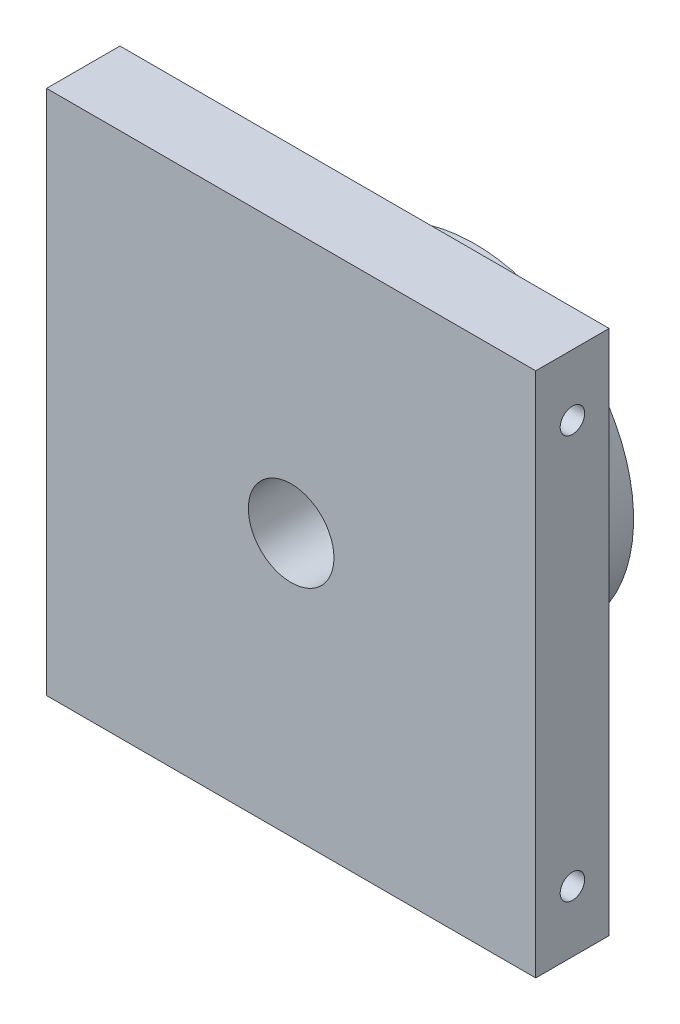
ISO-10303-21;
HEADER;
FILE_DESCRIPTION(('STEP AP214'),'2;1');
FILE_NAME('part.step','',(''),(''),'','','');
FILE_SCHEMA(('AUTOMOTIVE_DESIGN { 1 0 10303 214 1 1 1 1 }'));
ENDSEC;
DATA;
#1=APPLICATION_CONTEXT('core data for automotive mechanical design processes');
#2=APPLICATION_PROTOCOL_DEFINITION('international standard','automotive_design',2000,#1);
#3=PRODUCT_CONTEXT('',#1,'mechanical');
#4=PRODUCT('Part','Part','',(#3));
#5=PRODUCT_RELATED_PRODUCT_CATEGORY('part','',(#4));
#6=PRODUCT_DEFINITION_FORMATION('','',#4);
#7=PRODUCT_DEFINITION_CONTEXT('part definition',#1,'design');
#8=PRODUCT_DEFINITION('design','',#6,#7);
#9=PRODUCT_DEFINITION_SHAPE('','',#8);
#10=(LENGTH_UNIT() NAMED_UNIT(*) SI_UNIT(.MILLI.,.METRE.));
#11=(NAMED_UNIT(*) PLANE_ANGLE_UNIT() SI_UNIT($,.RADIAN.));
#12=(NAMED_UNIT(*) SI_UNIT($,.STERADIAN.) SOLID_ANGLE_UNIT());
#13=UNCERTAINTY_MEASURE_WITH_UNIT(LENGTH_MEASURE(1.E-05),#10,'distance_accuracy_value','');
#14=(GEOMETRIC_REPRESENTATION_CONTEXT(3) GLOBAL_UNCERTAINTY_ASSIGNED_CONTEXT((#13)) GLOBAL_UNIT_ASSIGNED_CONTEXT((#10,
#11,#12)) REPRESENTATION_CONTEXT('',''));
#15=CARTESIAN_POINT('',(0.,0.,0.));
#16=DIRECTION('',(0.,0.,1.));
#17=DIRECTION('',(1.,0.,0.));
#18=AXIS2_PLACEMENT_3D('',#15,#16,#17);
#19=CARTESIAN_POINT('',(0.,0.,6.));
#20=DIRECTION('',(0.,0.,-1.));
#21=DIRECTION('',(-1.,0.,0.));
#22=AXIS2_PLACEMENT_3D('',#19,#20,#21);
#23=PLANE('',#22);
#24=CARTESIAN_POINT('',(0.,0.,6.));
#25=DIRECTION('',(0.,0.,1.));
#26=DIRECTION('',(1.,0.,0.));
#27=AXIS2_PLACEMENT_3D('',#24,#25,#26);
#28=CIRCLE('',#27,3.5);
#29=CARTESIAN_POINT('',(3.5,0.,6.));
#30=VERTEX_POINT('',#29);
#31=EDGE_CURVE('E149',#30,#30,#28,.T.);
#32=ORIENTED_EDGE('',*,*,#31,.F.);
#33=EDGE_LOOP('',(#32));
#34=FACE_BOUND('',#33,.T.);
#35=DIRECTION('',(0.,1.,0.));
#36=VECTOR('',#35,1.);
#37=CARTESIAN_POINT('',(20.,-21.5,6.));
#38=LINE('',#37,#36);
#39=CARTESIAN_POINT('',(20.,-21.5,6.));
#40=VERTEX_POINT('',#39);
#41=CARTESIAN_POINT('',(20.,21.5,6.));
#42=VERTEX_POINT('',#41);
#43=EDGE_CURVE('E97',#40,#42,#38,.T.);
#44=ORIENTED_EDGE('',*,*,#43,.T.);
#45=DIRECTION('',(-1.,0.,0.));
#46=VECTOR('',#45,1.);
#47=CARTESIAN_POINT('',(-20.,21.5,6.));
#48=LINE('',#47,#46);
#49=CARTESIAN_POINT('',(-20.,21.5,6.));
#50=VERTEX_POINT('',#49);
#51=EDGE_CURVE('E93',#42,#50,#48,.T.);
#52=ORIENTED_EDGE('',*,*,#51,.T.);
#53=DIRECTION('',(0.,-1.,0.));
#54=VECTOR('',#53,1.);
#55=CARTESIAN_POINT('',(-20.,-21.5,6.));
#56=LINE('',#55,#54);
#57=CARTESIAN_POINT('',(-20.,-21.5,6.));
#58=VERTEX_POINT('',#57);
#59=EDGE_CURVE('E95',#50,#58,#56,.T.);
#60=ORIENTED_EDGE('',*,*,#59,.T.);
#61=DIRECTION('',(1.,0.,0.));
#62=VECTOR('',#61,1.);
#63=CARTESIAN_POINT('',(-20.,-21.5,6.));
#64=LINE('',#63,#62);
#65=EDGE_CURVE('E62',#58,#40,#64,.T.);
#66=ORIENTED_EDGE('',*,*,#65,.T.);
#67=EDGE_LOOP('',(#44,#52,#60,#66));
#68=FACE_BOUND('',#67,.T.);
#69=ADVANCED_FACE('F44',(#34,#68),#23,.F.);
#70=CARTESIAN_POINT('',(0.,0.,0.));
#71=DIRECTION('',(0.,0.,-1.));
#72=DIRECTION('',(-1.,0.,0.));
#73=AXIS2_PLACEMENT_3D('',#70,#71,#72);
#74=PLANE('',#73);
#75=CARTESIAN_POINT('',(0.,0.,0.));
#76=DIRECTION('',(0.,0.,-1.));
#77=DIRECTION('',(-1.,0.,0.));
#78=AXIS2_PLACEMENT_3D('',#75,#76,#77);
#79=CIRCLE('',#78,13.);
#80=CARTESIAN_POINT('',(-13.,0.,0.));
#81=VERTEX_POINT('',#80);
#82=EDGE_CURVE('E54',#81,#81,#79,.T.);
#83=ORIENTED_EDGE('',*,*,#82,.F.);
#84=EDGE_LOOP('',(#83));
#85=FACE_BOUND('',#84,.T.);
#86=DIRECTION('',(0.,1.,0.));
#87=VECTOR('',#86,1.);
#88=CARTESIAN_POINT('',(20.,-21.5,0.));
#89=LINE('',#88,#87);
#90=CARTESIAN_POINT('',(20.,-21.5,0.));
#91=VERTEX_POINT('',#90);
#92=CARTESIAN_POINT('',(20.,21.5,0.));
#93=VERTEX_POINT('',#92);
#94=EDGE_CURVE('E112',#91,#93,#89,.T.);
#95=ORIENTED_EDGE('',*,*,#94,.F.);
#96=DIRECTION('',(1.,0.,0.));
#97=VECTOR('',#96,1.);
#98=CARTESIAN_POINT('',(-20.,-21.5,0.));
#99=LINE('',#98,#97);
#100=CARTESIAN_POINT('',(-20.,-21.5,0.));
#101=VERTEX_POINT('',#100);
#102=EDGE_CURVE('E85',#101,#91,#99,.T.);
#103=ORIENTED_EDGE('',*,*,#102,.F.);
#104=DIRECTION('',(0.,-1.,0.));
#105=VECTOR('',#104,1.);
#106=CARTESIAN_POINT('',(-20.,-21.5,0.));
#107=LINE('',#106,#105);
#108=CARTESIAN_POINT('',(-20.,21.5,0.));
#109=VERTEX_POINT('',#108);
#110=EDGE_CURVE('E79',#109,#101,#107,.T.);
#111=ORIENTED_EDGE('',*,*,#110,.F.);
#112=DIRECTION('',(-1.,0.,0.));
#113=VECTOR('',#112,1.);
#114=CARTESIAN_POINT('',(-20.,21.5,0.));
#115=LINE('',#114,#113);
#116=EDGE_CURVE('E102',#93,#109,#115,.T.);
#117=ORIENTED_EDGE('',*,*,#116,.F.);
#118=EDGE_LOOP('',(#95,#103,#111,#117));
#119=FACE_BOUND('',#118,.T.);
#120=ADVANCED_FACE('F157',(#85,#119),#74,.T.);
#121=CARTESIAN_POINT('',(20.,-21.5,6.));
#122=DIRECTION('',(-1.,0.,0.));
#123=DIRECTION('',(0.,0.,1.));
#124=AXIS2_PLACEMENT_3D('',#121,#122,#123);
#125=PLANE('',#124);
#126=CARTESIAN_POINT('',(20.,16.5,3.));
#127=DIRECTION('',(1.,0.,0.));
#128=DIRECTION('',(0.,0.,-1.));
#129=AXIS2_PLACEMENT_3D('',#126,#127,#128);
#130=CIRCLE('',#129,1.);
#131=CARTESIAN_POINT('',(20.,16.5,2.));
#132=VERTEX_POINT('',#131);
#133=EDGE_CURVE('E131',#132,#132,#130,.T.);
#134=ORIENTED_EDGE('',*,*,#133,.F.);
#135=EDGE_LOOP('',(#134));
#136=FACE_BOUND('',#135,.T.);
#137=CARTESIAN_POINT('',(20.,-16.5,3.));
#138=DIRECTION('',(1.,0.,0.));
#139=DIRECTION('',(0.,0.,-1.));
#140=AXIS2_PLACEMENT_3D('',#137,#138,#139);
#141=CIRCLE('',#140,1.);
#142=CARTESIAN_POINT('',(20.,-16.5,1.99999999999999));
#143=VERTEX_POINT('',#142);
#144=EDGE_CURVE('E134',#143,#143,#141,.T.);
#145=ORIENTED_EDGE('',*,*,#144,.F.);
#146=EDGE_LOOP('',(#145));
#147=FACE_BOUND('',#146,.T.);
#148=ORIENTED_EDGE('',*,*,#94,.T.);
#149=DIRECTION('',(0.,0.,-1.));
#150=VECTOR('',#149,1.);
#151=CARTESIAN_POINT('',(20.,21.5,6.));
#152=LINE('',#151,#150);
#153=EDGE_CURVE('E103',#42,#93,#152,.T.);
#154=ORIENTED_EDGE('',*,*,#153,.F.);
#155=ORIENTED_EDGE('',*,*,#43,.F.);
#156=DIRECTION('',(0.,0.,-1.));
#157=VECTOR('',#156,1.);
#158=CARTESIAN_POINT('',(20.,-21.5,6.));
#159=LINE('',#158,#157);
#160=EDGE_CURVE('E108',#40,#91,#159,.T.);
#161=ORIENTED_EDGE('',*,*,#160,.T.);
#162=EDGE_LOOP('',(#148,#154,#155,#161));
#163=FACE_BOUND('',#162,.T.);
#164=ADVANCED_FACE('F46',(#136,#147,#163),#125,.F.);
#165=CARTESIAN_POINT('',(-20.,21.5,6.));
#166=DIRECTION('',(0.,-1.,0.));
#167=DIRECTION('',(0.,0.,-1.));
#168=AXIS2_PLACEMENT_3D('',#165,#166,#167);
#169=PLANE('',#168);
#170=ORIENTED_EDGE('',*,*,#116,.T.);
#171=DIRECTION('',(0.,0.,-1.));
#172=VECTOR('',#171,1.);
#173=CARTESIAN_POINT('',(-20.,21.5,6.));
#174=LINE('',#173,#172);
#175=EDGE_CURVE('E100',#50,#109,#174,.T.);
#176=ORIENTED_EDGE('',*,*,#175,.F.);
#177=ORIENTED_EDGE('',*,*,#51,.F.);
#178=ORIENTED_EDGE('',*,*,#153,.T.);
#179=EDGE_LOOP('',(#170,#176,#177,#178));
#180=FACE_BOUND('',#179,.T.);
#181=ADVANCED_FACE('F101',(#180),#169,.F.);
#182=CARTESIAN_POINT('',(-20.,-21.5,6.));
#183=DIRECTION('',(1.,0.,0.));
#184=DIRECTION('',(0.,0.,-1.));
#185=AXIS2_PLACEMENT_3D('',#182,#183,#184);
#186=PLANE('',#185);
#187=CARTESIAN_POINT('',(-20.,16.5,3.));
#188=DIRECTION('',(1.,0.,0.));
#189=DIRECTION('',(0.,0.,-1.));
#190=AXIS2_PLACEMENT_3D('',#187,#188,#189);
#191=CIRCLE('',#190,1.);
#192=CARTESIAN_POINT('',(-20.,16.5,2.));
#193=VERTEX_POINT('',#192);
#194=EDGE_CURVE('E115',#193,#193,#191,.T.);
#195=ORIENTED_EDGE('',*,*,#194,.T.);
#196=EDGE_LOOP('',(#195));
#197=FACE_BOUND('',#196,.T.);
#198=CARTESIAN_POINT('',(-20.,-16.5,3.));
#199=DIRECTION('',(1.,0.,0.));
#200=DIRECTION('',(0.,0.,-1.));
#201=AXIS2_PLACEMENT_3D('',#198,#199,#200);
#202=CIRCLE('',#201,1.);
#203=CARTESIAN_POINT('',(-20.,-16.5,1.99999999999999));
#204=VERTEX_POINT('',#203);
#205=EDGE_CURVE('E137',#204,#204,#202,.T.);
#206=ORIENTED_EDGE('',*,*,#205,.T.);
#207=EDGE_LOOP('',(#206));
#208=FACE_BOUND('',#207,.T.);
#209=ORIENTED_EDGE('',*,*,#110,.T.);
#210=DIRECTION('',(0.,0.,-1.));
#211=VECTOR('',#210,1.);
#212=CARTESIAN_POINT('',(-20.,-21.5,6.));
#213=LINE('',#212,#211);
#214=EDGE_CURVE('E104',#58,#101,#213,.T.);
#215=ORIENTED_EDGE('',*,*,#214,.F.);
#216=ORIENTED_EDGE('',*,*,#59,.F.);
#217=ORIENTED_EDGE('',*,*,#175,.T.);
#218=EDGE_LOOP('',(#209,#215,#216,#217));
#219=FACE_BOUND('',#218,.T.);
#220=ADVANCED_FACE('F106',(#197,#208,#219),#186,.F.);
#221=CARTESIAN_POINT('',(-20.,-21.5,6.));
#222=DIRECTION('',(0.,1.,0.));
#223=DIRECTION('',(0.,0.,1.));
#224=AXIS2_PLACEMENT_3D('',#221,#222,#223);
#225=PLANE('',#224);
#226=ORIENTED_EDGE('',*,*,#102,.T.);
#227=ORIENTED_EDGE('',*,*,#160,.F.);
#228=ORIENTED_EDGE('',*,*,#65,.F.);
#229=ORIENTED_EDGE('',*,*,#214,.T.);
#230=EDGE_LOOP('',(#226,#227,#228,#229));
#231=FACE_BOUND('',#230,.T.);
#232=ADVANCED_FACE('F168',(#231),#225,.F.);
#233=CARTESIAN_POINT('',(-20.,-16.5,3.));
#234=DIRECTION('',(1.,0.,0.));
#235=DIRECTION('',(0.,0.,-1.));
#236=AXIS2_PLACEMENT_3D('',#233,#234,#235);
#237=CYLINDRICAL_SURFACE('',#236,1.);
#238=ORIENTED_EDGE('',*,*,#205,.F.);
#239=EDGE_LOOP('',(#238));
#240=FACE_BOUND('',#239,.T.);
#241=ORIENTED_EDGE('',*,*,#144,.T.);
#242=EDGE_LOOP('',(#241));
#243=FACE_BOUND('',#242,.T.);
#244=ADVANCED_FACE('F165',(#240,#243),#237,.F.);
#245=CARTESIAN_POINT('',(-20.,16.5,3.));
#246=DIRECTION('',(1.,0.,0.));
#247=DIRECTION('',(0.,0.,-1.));
#248=AXIS2_PLACEMENT_3D('',#245,#246,#247);
#249=CYLINDRICAL_SURFACE('',#248,1.);
#250=ORIENTED_EDGE('',*,*,#194,.F.);
#251=EDGE_LOOP('',(#250));
#252=FACE_BOUND('',#251,.T.);
#253=ORIENTED_EDGE('',*,*,#133,.T.);
#254=EDGE_LOOP('',(#253));
#255=FACE_BOUND('',#254,.T.);
#256=ADVANCED_FACE('F188',(#252,#255),#249,.F.);
#257=CARTESIAN_POINT('',(0.,0.,-4.));
#258=DIRECTION('',(0.,0.,1.));
#259=DIRECTION('',(1.,0.,0.));
#260=AXIS2_PLACEMENT_3D('',#257,#258,#259);
#261=CYLINDRICAL_SURFACE('',#260,13.);
#262=ORIENTED_EDGE('',*,*,#82,.T.);
#263=EDGE_LOOP('',(#262));
#264=FACE_BOUND('',#263,.T.);
#265=CARTESIAN_POINT('',(0.,0.,-9.));
#266=DIRECTION('',(0.,0.,-1.));
#267=DIRECTION('',(-1.,0.,0.));
#268=AXIS2_PLACEMENT_3D('',#265,#266,#267);
#269=CIRCLE('',#268,13.);
#270=CARTESIAN_POINT('',(-13.,0.,-9.));
#271=VERTEX_POINT('',#270);
#272=EDGE_CURVE('E127',#271,#271,#269,.T.);
#273=ORIENTED_EDGE('',*,*,#272,.F.);
#274=EDGE_LOOP('',(#273));
#275=FACE_BOUND('',#274,.T.);
#276=ADVANCED_FACE('F193',(#264,#275),#261,.T.);
#277=CARTESIAN_POINT('',(0.,0.,-9.));
#278=DIRECTION('',(0.,0.,-1.));
#279=DIRECTION('',(-1.,0.,0.));
#280=AXIS2_PLACEMENT_3D('',#277,#278,#279);
#281=PLANE('',#280);
#282=ORIENTED_EDGE('',*,*,#272,.T.);
#283=EDGE_LOOP('',(#282));
#284=FACE_BOUND('',#283,.T.);
#285=CARTESIAN_POINT('',(0.,0.,-9.));
#286=DIRECTION('',(0.,0.,-1.));
#287=DIRECTION('',(-1.,0.,0.));
#288=AXIS2_PLACEMENT_3D('',#285,#286,#287);
#289=CIRCLE('',#288,12.2);
#290=CARTESIAN_POINT('',(-12.2,0.,-9.));
#291=VERTEX_POINT('',#290);
#292=EDGE_CURVE('E142',#291,#291,#289,.T.);
#293=ORIENTED_EDGE('',*,*,#292,.F.);
#294=EDGE_LOOP('',(#293));
#295=FACE_BOUND('',#294,.T.);
#296=ADVANCED_FACE('F198',(#284,#295),#281,.T.);
#297=CARTESIAN_POINT('',(0.,0.,-9.));
#298=DIRECTION('',(0.,0.,1.));
#299=DIRECTION('',(1.,0.,0.));
#300=AXIS2_PLACEMENT_3D('',#297,#298,#299);
#301=CYLINDRICAL_SURFACE('',#300,12.2);
#302=ORIENTED_EDGE('',*,*,#292,.T.);
#303=EDGE_LOOP('',(#302));
#304=FACE_BOUND('',#303,.T.);
#305=CARTESIAN_POINT('',(0.,0.,-4.));
#306=DIRECTION('',(0.,0.,-1.));
#307=DIRECTION('',(-1.,0.,0.));
#308=AXIS2_PLACEMENT_3D('',#305,#306,#307);
#309=CIRCLE('',#308,12.2);
#310=CARTESIAN_POINT('',(-12.2,0.,-4.));
#311=VERTEX_POINT('',#310);
#312=EDGE_CURVE('E12',#311,#311,#309,.F.);
#313=ORIENTED_EDGE('',*,*,#312,.T.);
#314=EDGE_LOOP('',(#313));
#315=FACE_BOUND('',#314,.T.);
#316=ADVANCED_FACE('F206',(#304,#315),#301,.F.);
#317=CARTESIAN_POINT('',(0.,0.,-4.));
#318=DIRECTION('',(0.,0.,-1.));
#319=DIRECTION('',(-1.,0.,0.));
#320=AXIS2_PLACEMENT_3D('',#317,#318,#319);
#321=PLANE('',#320);
#322=CARTESIAN_POINT('',(0.,0.,-4.));
#323=DIRECTION('',(0.,0.,-1.));
#324=DIRECTION('',(-1.,0.,0.));
#325=AXIS2_PLACEMENT_3D('',#322,#323,#324);
#326=CIRCLE('',#325,3.5);
#327=CARTESIAN_POINT('',(3.5,0.,-4.));
#328=VERTEX_POINT('',#327);
#329=EDGE_CURVE('E48',#328,#328,#326,.T.);
#330=ORIENTED_EDGE('',*,*,#329,.F.);
#331=EDGE_LOOP('',(#330));
#332=FACE_BOUND('',#331,.T.);
#333=ORIENTED_EDGE('',*,*,#312,.F.);
#334=EDGE_LOOP('',(#333));
#335=FACE_BOUND('',#334,.T.);
#336=ADVANCED_FACE('F203',(#332,#335),#321,.T.);
#337=CARTESIAN_POINT('',(0.,0.,-9.));
#338=DIRECTION('',(0.,0.,1.));
#339=DIRECTION('',(1.,0.,0.));
#340=AXIS2_PLACEMENT_3D('',#337,#338,#339);
#341=CYLINDRICAL_SURFACE('',#340,3.5);
#342=CARTESIAN_POINT('',(3.5,0.,-4.));
#343=CARTESIAN_POINT('',(3.5,0.,-3.89583333333333));
#344=CARTESIAN_POINT('',(3.5,0.,-3.79166666666667));
#345=CARTESIAN_POINT('',(3.5,0.,-3.58333333333333));
#346=CARTESIAN_POINT('',(3.5,0.,-3.47916666666667));
#347=CARTESIAN_POINT('',(3.5,0.,-3.27083333333333));
#348=CARTESIAN_POINT('',(3.5,0.,-3.16666666666667));
#349=CARTESIAN_POINT('',(3.5,0.,-2.95833333333333));
#350=CARTESIAN_POINT('',(3.5,0.,-2.85416666666667));
#351=CARTESIAN_POINT('',(3.5,0.,-2.64583333333333));
#352=CARTESIAN_POINT('',(3.5,0.,-2.54166666666667));
#353=CARTESIAN_POINT('',(3.5,0.,-2.33333333333333));
#354=CARTESIAN_POINT('',(3.5,0.,-2.22916666666667));
#355=CARTESIAN_POINT('',(3.5,0.,-2.02083333333333));
#356=CARTESIAN_POINT('',(3.5,0.,-1.91666666666667));
#357=CARTESIAN_POINT('',(3.5,0.,-1.70833333333333));
#358=CARTESIAN_POINT('',(3.5,0.,-1.60416666666667));
#359=CARTESIAN_POINT('',(3.5,0.,-1.39583333333333));
#360=CARTESIAN_POINT('',(3.5,0.,-1.29166666666667));
#361=CARTESIAN_POINT('',(3.5,0.,-1.08333333333333));
#362=CARTESIAN_POINT('',(3.5,0.,-0.979166666666666));
#363=CARTESIAN_POINT('',(3.5,0.,-0.770833333333333));
#364=CARTESIAN_POINT('',(3.5,0.,-0.666666666666667));
#365=CARTESIAN_POINT('',(3.5,0.,-0.458333333333334));
#366=CARTESIAN_POINT('',(3.5,0.,-0.354166666666667));
#367=CARTESIAN_POINT('',(3.5,0.,-0.145833333333333));
#368=CARTESIAN_POINT('',(3.5,0.,-0.0416666666666667));
#369=CARTESIAN_POINT('',(3.5,0.,0.166666666666667));
#370=CARTESIAN_POINT('',(3.5,0.,0.270833333333334));
#371=CARTESIAN_POINT('',(3.5,0.,0.479166666666667));
#372=CARTESIAN_POINT('',(3.5,0.,0.583333333333333));
#373=CARTESIAN_POINT('',(3.5,0.,0.791666666666666));
#374=CARTESIAN_POINT('',(3.5,0.,0.895833333333332));
#375=CARTESIAN_POINT('',(3.5,0.,1.10416666666667));
#376=CARTESIAN_POINT('',(3.5,0.,1.20833333333333));
#377=CARTESIAN_POINT('',(3.5,0.,1.41666666666667));
#378=CARTESIAN_POINT('',(3.5,0.,1.52083333333333));
#379=CARTESIAN_POINT('',(3.5,0.,1.72916666666667));
#380=CARTESIAN_POINT('',(3.5,0.,1.83333333333333));
#381=CARTESIAN_POINT('',(3.5,0.,2.04166666666667));
#382=CARTESIAN_POINT('',(3.5,0.,2.14583333333333));
#383=CARTESIAN_POINT('',(3.5,0.,2.35416666666667));
#384=CARTESIAN_POINT('',(3.5,0.,2.45833333333333));
#385=CARTESIAN_POINT('',(3.5,0.,2.66666666666667));
#386=CARTESIAN_POINT('',(3.5,0.,2.77083333333333));
#387=CARTESIAN_POINT('',(3.5,0.,2.97916666666667));
#388=CARTESIAN_POINT('',(3.5,0.,3.08333333333333));
#389=CARTESIAN_POINT('',(3.5,0.,3.29166666666667));
#390=CARTESIAN_POINT('',(3.5,0.,3.39583333333333));
#391=CARTESIAN_POINT('',(3.5,0.,3.60416666666667));
#392=CARTESIAN_POINT('',(3.5,0.,3.70833333333333));
#393=CARTESIAN_POINT('',(3.5,0.,3.91666666666667));
#394=CARTESIAN_POINT('',(3.5,0.,4.02083333333333));
#395=CARTESIAN_POINT('',(3.5,0.,4.22916666666667));
#396=CARTESIAN_POINT('',(3.5,0.,4.33333333333333));
#397=CARTESIAN_POINT('',(3.5,0.,4.54166666666667));
#398=CARTESIAN_POINT('',(3.5,0.,4.64583333333333));
#399=CARTESIAN_POINT('',(3.5,0.,4.85416666666667));
#400=CARTESIAN_POINT('',(3.5,0.,4.95833333333333));
#401=CARTESIAN_POINT('',(3.5,0.,5.16666666666667));
#402=CARTESIAN_POINT('',(3.5,0.,5.27083333333333));
#403=CARTESIAN_POINT('',(3.5,0.,5.47916666666667));
#404=CARTESIAN_POINT('',(3.5,0.,5.58333333333333));
#405=CARTESIAN_POINT('',(3.5,0.,5.79166666666667));
#406=CARTESIAN_POINT('',(3.5,0.,5.89583333333333));
#407=CARTESIAN_POINT('',(3.5,0.,6.));
#408=B_SPLINE_CURVE_WITH_KNOTS('',3,(#342,#343,#344,#345,#346,#347,#348,#349,#350,#351,#352,
#353,#354,#355,#356,#357,#358,#359,#360,#361,#362,#363,#364,#365,#366,#367,#368,#369,#370,#371,
#372,#373,#374,#375,#376,#377,#378,#379,#380,#381,#382,#383,#384,#385,#386,#387,#388,#389,#390,
#391,#392,#393,#394,#395,#396,#397,#398,#399,#400,#401,#402,#403,#404,#405,#406,#407),
.UNSPECIFIED.,.F.,.F.,(4,2,2,2,2,2,2,2,2,2,2,2,2,2,2,2,2,2,2,2,2,2,2,2,2,2,2,2,2,2,2,2,4),(0.,
0.3125,0.625,0.9375,1.25,1.5625,1.875,2.1875,2.5,2.8125,3.125,3.4375,3.75,4.0625,4.375,4.6875,
5.,5.3125,5.625,5.9375,6.25,6.5625,6.875,7.1875,7.5,7.8125,8.125,8.4375,8.75,9.0625,9.375,
9.6875,10.),.UNSPECIFIED.);
#409=EDGE_CURVE('BSEAM154',#328,#30,#408,.T.);
#410=ORIENTED_EDGE('',*,*,#329,.T.);
#411=ORIENTED_EDGE('',*,*,#31,.T.);
#412=ORIENTED_EDGE('',*,*,#409,.T.);
#413=ORIENTED_EDGE('',*,*,#409,.F.);
#414=EDGE_LOOP('',(#410,#412,#411,#413));
#415=FACE_BOUND('',#414,.T.);
#416=ADVANCED_FACE('F154',(#415),#341,.F.);
#417=CLOSED_SHELL('',(#69,#120,#164,#181,#220,#232,#244,#256,#276,#296,#316,#336,#416));
#418=MANIFOLD_SOLID_BREP('B2',#417);
#419=ADVANCED_BREP_SHAPE_REPRESENTATION('',(#18,#418),#14);
#420=SHAPE_DEFINITION_REPRESENTATION(#9,#419);
ENDSEC;
END-ISO-10303-21;
